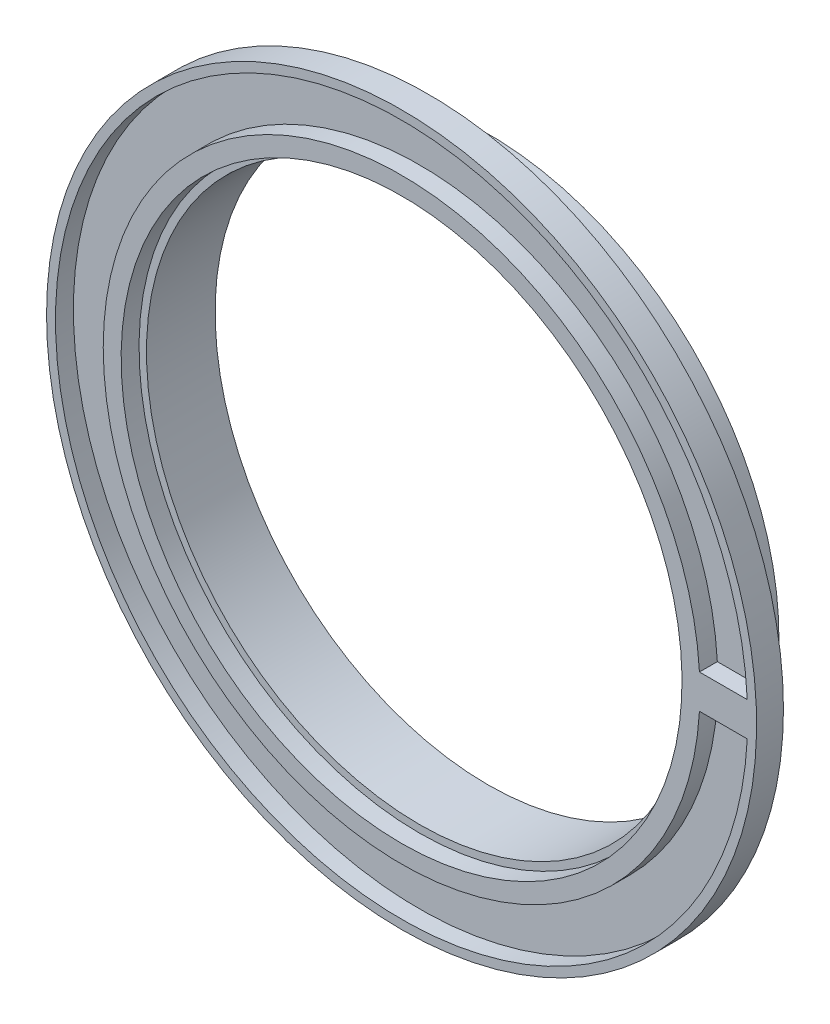
ISO-10303-21;
HEADER;
FILE_DESCRIPTION(('STEP AP214'),'2;1');
FILE_NAME('part.step','',(''),(''),'','','');
FILE_SCHEMA(('AUTOMOTIVE_DESIGN { 1 0 10303 214 1 1 1 1 }'));
ENDSEC;
DATA;
#1=APPLICATION_CONTEXT('core data for automotive mechanical design processes');
#2=APPLICATION_PROTOCOL_DEFINITION('international standard','automotive_design',2000,#1);
#3=PRODUCT_CONTEXT('',#1,'mechanical');
#4=PRODUCT('Part','Part','',(#3));
#5=PRODUCT_RELATED_PRODUCT_CATEGORY('part','',(#4));
#6=PRODUCT_DEFINITION_FORMATION('','',#4);
#7=PRODUCT_DEFINITION_CONTEXT('part definition',#1,'design');
#8=PRODUCT_DEFINITION('design','',#6,#7);
#9=PRODUCT_DEFINITION_SHAPE('','',#8);
#10=(LENGTH_UNIT() NAMED_UNIT(*) SI_UNIT(.MILLI.,.METRE.));
#11=(NAMED_UNIT(*) PLANE_ANGLE_UNIT() SI_UNIT($,.RADIAN.));
#12=(NAMED_UNIT(*) SI_UNIT($,.STERADIAN.) SOLID_ANGLE_UNIT());
#13=UNCERTAINTY_MEASURE_WITH_UNIT(LENGTH_MEASURE(1.E-05),#10,'distance_accuracy_value','');
#14=(GEOMETRIC_REPRESENTATION_CONTEXT(3) GLOBAL_UNCERTAINTY_ASSIGNED_CONTEXT((#13)) GLOBAL_UNIT_ASSIGNED_CONTEXT((#10,
#11,#12)) REPRESENTATION_CONTEXT('',''));
#15=CARTESIAN_POINT('',(0.,0.,0.));
#16=DIRECTION('',(0.,0.,1.));
#17=DIRECTION('',(1.,0.,0.));
#18=AXIS2_PLACEMENT_3D('',#15,#16,#17);
#19=CARTESIAN_POINT('',(-0.0195470693560484,0.0021960919807713,81.7922710574948));
#20=DIRECTION('',(0.,0.,1.));
#21=DIRECTION('',(0.,-1.,0.));
#22=AXIS2_PLACEMENT_3D('',#19,#20,#21);
#23=CYLINDRICAL_SURFACE('',#22,58.);
#24=DIRECTION('',(0.,0.,-1.));
#25=VECTOR('',#24,1.);
#26=CARTESIAN_POINT('',(57.9103890604235,2.85219609192162,84.7922710574948));
#27=LINE('',#26,#25);
#28=CARTESIAN_POINT('',(57.9103890604235,2.85219609192162,84.7922710574948));
#29=VERTEX_POINT('',#28);
#30=CARTESIAN_POINT('',(57.9103890604235,2.85219609192162,81.7922710574948));
#31=VERTEX_POINT('',#30);
#32=EDGE_CURVE('E35',#29,#31,#27,.T.);
#33=ORIENTED_EDGE('',*,*,#32,.F.);
#34=CARTESIAN_POINT('',(-0.0195470693560484,0.0021960919807713,84.7922710574948));
#35=DIRECTION('',(0.,0.,1.));
#36=DIRECTION('',(0.,-1.,0.));
#37=AXIS2_PLACEMENT_3D('',#34,#35,#36);
#38=CIRCLE('',#37,58.);
#39=CARTESIAN_POINT('',(57.9103890604199,-2.84780390803485,84.7922710574948));
#40=VERTEX_POINT('',#39);
#41=EDGE_CURVE('E11',#29,#40,#38,.T.);
#42=ORIENTED_EDGE('',*,*,#41,.T.);
#43=DIRECTION('',(0.,0.,-1.));
#44=VECTOR('',#43,1.);
#45=CARTESIAN_POINT('',(57.9103890604199,-2.84780390803485,84.7922710574948));
#46=LINE('',#45,#44);
#47=CARTESIAN_POINT('',(57.9103890604199,-2.84780390803485,81.7922710574948));
#48=VERTEX_POINT('',#47);
#49=EDGE_CURVE('E27',#40,#48,#46,.T.);
#50=ORIENTED_EDGE('',*,*,#49,.T.);
#51=CARTESIAN_POINT('',(-0.0195470693560484,0.0021960919807713,81.7922710574948));
#52=DIRECTION('',(0.,0.,1.));
#53=DIRECTION('',(0.,-1.,0.));
#54=AXIS2_PLACEMENT_3D('',#51,#52,#53);
#55=CIRCLE('',#54,58.);
#56=EDGE_CURVE('E128',#31,#48,#55,.T.);
#57=ORIENTED_EDGE('',*,*,#56,.F.);
#58=EDGE_LOOP('',(#33,#42,#50,#57));
#59=FACE_BOUND('',#58,.T.);
#60=ADVANCED_FACE('F17',(#59),#23,.F.);
#61=CARTESIAN_POINT('',(-0.0195470693560484,0.0021960919807713,81.7922710574948));
#62=DIRECTION('',(0.,0.,1.));
#63=DIRECTION('',(0.,-1.,0.));
#64=AXIS2_PLACEMENT_3D('',#61,#62,#63);
#65=CYLINDRICAL_SURFACE('',#64,50.);
#66=DIRECTION('',(0.,0.,-1.));
#67=VECTOR('',#66,1.);
#68=CARTESIAN_POINT('',(49.8991618482431,2.85219609198071,84.7922710574948));
#69=LINE('',#68,#67);
#70=CARTESIAN_POINT('',(49.8991618482431,2.85219609198071,84.7922710574948));
#71=VERTEX_POINT('',#70);
#72=CARTESIAN_POINT('',(49.8991618482431,2.85219609198071,81.7922710574948));
#73=VERTEX_POINT('',#72);
#74=EDGE_CURVE('E134',#71,#73,#69,.T.);
#75=ORIENTED_EDGE('',*,*,#74,.T.);
#76=CARTESIAN_POINT('',(-0.0195470693560484,0.0021960919807713,81.7922710574948));
#77=DIRECTION('',(0.,0.,-1.));
#78=DIRECTION('',(0.,-1.,0.));
#79=AXIS2_PLACEMENT_3D('',#76,#77,#78);
#80=CIRCLE('',#79,50.);
#81=CARTESIAN_POINT('',(49.8991618482431,-2.84780390801929,81.7922710574948));
#82=VERTEX_POINT('',#81);
#83=EDGE_CURVE('E135',#82,#73,#80,.T.);
#84=ORIENTED_EDGE('',*,*,#83,.F.);
#85=DIRECTION('',(0.,0.,-1.));
#86=VECTOR('',#85,1.);
#87=CARTESIAN_POINT('',(49.8991618482429,-2.84780390802395,84.7922710574948));
#88=LINE('',#87,#86);
#89=CARTESIAN_POINT('',(49.8991618482429,-2.84780390802395,84.7922710574948));
#90=VERTEX_POINT('',#89);
#91=EDGE_CURVE('E89',#90,#82,#88,.T.);
#92=ORIENTED_EDGE('',*,*,#91,.F.);
#93=CARTESIAN_POINT('',(-0.0195470693560484,0.0021960919807713,84.7922710574948));
#94=DIRECTION('',(0.,0.,-1.));
#95=DIRECTION('',(0.,-1.,0.));
#96=AXIS2_PLACEMENT_3D('',#93,#94,#95);
#97=CIRCLE('',#96,50.);
#98=EDGE_CURVE('E133',#90,#71,#97,.T.);
#99=ORIENTED_EDGE('',*,*,#98,.T.);
#100=EDGE_LOOP('',(#75,#84,#92,#99));
#101=FACE_BOUND('',#100,.T.);
#102=ADVANCED_FACE('F153',(#101),#65,.T.);
#103=CARTESIAN_POINT('',(-0.0195470693560484,0.0021960919807713,81.7922710574948));
#104=DIRECTION('',(0.,0.,1.));
#105=DIRECTION('',(0.,-1.,0.));
#106=AXIS2_PLACEMENT_3D('',#103,#104,#105);
#107=PLANE('',#106);
#108=ORIENTED_EDGE('',*,*,#83,.T.);
#109=DIRECTION('',(-1.,0.,0.));
#110=VECTOR('',#109,1.);
#111=CARTESIAN_POINT('',(57.9103890604206,2.8521960919807,81.7922710574948));
#112=LINE('',#111,#110);
#113=EDGE_CURVE('E107',#31,#73,#112,.T.);
#114=ORIENTED_EDGE('',*,*,#113,.F.);
#115=ORIENTED_EDGE('',*,*,#56,.T.);
#116=DIRECTION('',(1.,0.,0.));
#117=VECTOR('',#116,1.);
#118=CARTESIAN_POINT('',(49.8991618482431,-2.84780390801929,81.7922710574948));
#119=LINE('',#118,#117);
#120=EDGE_CURVE('E91',#82,#48,#119,.T.);
#121=ORIENTED_EDGE('',*,*,#120,.F.);
#122=EDGE_LOOP('',(#108,#114,#115,#121));
#123=FACE_BOUND('',#122,.T.);
#124=ADVANCED_FACE('F150',(#123),#107,.T.);
#125=CARTESIAN_POINT('',(-0.0195470693560484,0.0021960919807713,84.7922710574948));
#126=DIRECTION('',(0.,0.,-1.));
#127=DIRECTION('',(0.,1.,0.));
#128=AXIS2_PLACEMENT_3D('',#125,#126,#127);
#129=PLANE('',#128);
#130=CARTESIAN_POINT('',(-0.0195470693560484,0.0021960919807713,84.7922710574948));
#131=DIRECTION('',(0.,0.,-1.));
#132=DIRECTION('',(0.,-1.,0.));
#133=AXIS2_PLACEMENT_3D('',#130,#131,#132);
#134=CIRCLE('',#133,47.);
#135=CARTESIAN_POINT('',(-0.0195470693560427,-46.9978039080192,84.7922710574948));
#136=VERTEX_POINT('',#135);
#137=EDGE_CURVE('E125',#136,#136,#134,.T.);
#138=ORIENTED_EDGE('',*,*,#137,.T.);
#139=EDGE_LOOP('',(#138));
#140=FACE_BOUND('',#139,.T.);
#141=ORIENTED_EDGE('',*,*,#98,.F.);
#142=DIRECTION('',(1.,0.,0.));
#143=VECTOR('',#142,1.);
#144=CARTESIAN_POINT('',(49.8991618482431,-2.84780390801929,84.7922710574948));
#145=LINE('',#144,#143);
#146=EDGE_CURVE('E122',#90,#40,#145,.T.);
#147=ORIENTED_EDGE('',*,*,#146,.T.);
#148=ORIENTED_EDGE('',*,*,#41,.F.);
#149=DIRECTION('',(-1.,0.,0.));
#150=VECTOR('',#149,1.);
#151=CARTESIAN_POINT('',(57.9103890604206,2.8521960919807,84.7922710574948));
#152=LINE('',#151,#150);
#153=EDGE_CURVE('E117',#29,#71,#152,.T.);
#154=ORIENTED_EDGE('',*,*,#153,.T.);
#155=EDGE_LOOP('',(#141,#147,#148,#154));
#156=FACE_BOUND('',#155,.T.);
#157=CARTESIAN_POINT('',(-0.0195470693560484,0.0021960919807713,84.7922710574948));
#158=DIRECTION('',(0.,0.,-1.));
#159=DIRECTION('',(0.,-1.,0.));
#160=AXIS2_PLACEMENT_3D('',#157,#158,#159);
#161=CIRCLE('',#160,59.5);
#162=CARTESIAN_POINT('',(-0.0195470693560412,-59.4978039080192,84.7922710574948));
#163=VERTEX_POINT('',#162);
#164=EDGE_CURVE('E104',#163,#163,#161,.T.);
#165=ORIENTED_EDGE('',*,*,#164,.F.);
#166=EDGE_LOOP('',(#165));
#167=FACE_BOUND('',#166,.T.);
#168=ADVANCED_FACE('F156',(#140,#156,#167),#129,.F.);
#169=CARTESIAN_POINT('',(-0.0195470693560484,0.0021960919807713,80.2922710574948));
#170=DIRECTION('',(0.,0.,-1.));
#171=DIRECTION('',(0.,1.,0.));
#172=AXIS2_PLACEMENT_3D('',#169,#170,#171);
#173=PLANE('',#172);
#174=CARTESIAN_POINT('',(-0.0195470693560484,0.0021960919807713,80.2922710574948));
#175=DIRECTION('',(0.,0.,-1.));
#176=DIRECTION('',(0.,-1.,0.));
#177=AXIS2_PLACEMENT_3D('',#174,#175,#176);
#178=CIRCLE('',#177,59.5);
#179=CARTESIAN_POINT('',(-59.5195470693559,0.00219609241977516,80.2922710574948));
#180=VERTEX_POINT('',#179);
#181=EDGE_CURVE('E114',#180,#180,#178,.T.);
#182=ORIENTED_EDGE('',*,*,#181,.T.);
#183=CARTESIAN_POINT('',(-56.7695470693559,0.00219609239948497,80.2922710574948));
#184=DIRECTION('',(0.,0.,1.));
#185=DIRECTION('',(1.,0.,0.));
#186=AXIS2_PLACEMENT_3D('',#183,#184,#185);
#187=CIRCLE('',#186,2.75);
#188=EDGE_CURVE('E111',#180,#180,#187,.T.);
#189=ORIENTED_EDGE('',*,*,#188,.T.);
#190=EDGE_LOOP('',(#182,#189));
#191=FACE_BOUND('',#190,.T.);
#192=CARTESIAN_POINT('',(-0.0195470693560484,0.0021960919807713,80.2922710574948));
#193=DIRECTION('',(0.,0.,1.));
#194=DIRECTION('',(0.,-1.,0.));
#195=AXIS2_PLACEMENT_3D('',#192,#193,#194);
#196=CIRCLE('',#195,48.75);
#197=CARTESIAN_POINT('',(-0.0195470693560484,-48.7478039080192,80.2922710574948));
#198=VERTEX_POINT('',#197);
#199=EDGE_CURVE('E108',#198,#198,#196,.T.);
#200=ORIENTED_EDGE('',*,*,#199,.T.);
#201=EDGE_LOOP('',(#200));
#202=FACE_BOUND('',#201,.T.);
#203=ADVANCED_FACE('F184',(#191,#202),#173,.T.);
#204=CARTESIAN_POINT('',(-0.0195470693560484,0.0021960919807713,84.7922710574948));
#205=DIRECTION('',(0.,0.,-1.));
#206=DIRECTION('',(0.,1.,0.));
#207=AXIS2_PLACEMENT_3D('',#204,#205,#206);
#208=CYLINDRICAL_SURFACE('',#207,59.5);
#209=ORIENTED_EDGE('',*,*,#164,.T.);
#210=EDGE_LOOP('',(#209));
#211=FACE_BOUND('',#210,.T.);
#212=ORIENTED_EDGE('',*,*,#181,.F.);
#213=EDGE_LOOP('',(#212));
#214=FACE_BOUND('',#213,.T.);
#215=ADVANCED_FACE('F188',(#211,#214),#208,.T.);
#216=CARTESIAN_POINT('',(-0.0195470693560484,0.0021960919807713,84.7922710574948));
#217=DIRECTION('',(0.,0.,-1.));
#218=DIRECTION('',(0.,1.,0.));
#219=AXIS2_PLACEMENT_3D('',#216,#217,#218);
#220=CYLINDRICAL_SURFACE('',#219,45.75);
#221=CARTESIAN_POINT('',(-0.0195470693560484,0.0021960919807713,81.7922710574948));
#222=DIRECTION('',(0.,0.,-1.));
#223=DIRECTION('',(0.,1.,0.));
#224=AXIS2_PLACEMENT_3D('',#221,#222,#223);
#225=CIRCLE('',#224,45.75);
#226=CARTESIAN_POINT('',(-0.0195470693560484,45.7521960919808,81.7922710574948));
#227=VERTEX_POINT('',#226);
#228=EDGE_CURVE('E98',#227,#227,#225,.T.);
#229=ORIENTED_EDGE('',*,*,#228,.F.);
#230=EDGE_LOOP('',(#229));
#231=FACE_BOUND('',#230,.T.);
#232=CARTESIAN_POINT('',(-0.0195470693560484,0.0021960919807713,70.2922710574948));
#233=DIRECTION('',(0.,0.,-1.));
#234=DIRECTION('',(0.,-1.,0.));
#235=AXIS2_PLACEMENT_3D('',#232,#233,#234);
#236=CIRCLE('',#235,45.75);
#237=CARTESIAN_POINT('',(-0.0195470693560429,-45.7478039080192,70.2922710574948));
#238=VERTEX_POINT('',#237);
#239=EDGE_CURVE('E101',#238,#238,#236,.T.);
#240=ORIENTED_EDGE('',*,*,#239,.T.);
#241=EDGE_LOOP('',(#240));
#242=FACE_BOUND('',#241,.T.);
#243=ADVANCED_FACE('F192',(#231,#242),#220,.F.);
#244=CARTESIAN_POINT('',(-0.0195470693560484,0.0021960919807713,80.2922710574948));
#245=DIRECTION('',(0.,0.,-1.));
#246=DIRECTION('',(0.,1.,0.));
#247=AXIS2_PLACEMENT_3D('',#244,#245,#246);
#248=CYLINDRICAL_SURFACE('',#247,48.75);
#249=ORIENTED_EDGE('',*,*,#199,.F.);
#250=EDGE_LOOP('',(#249));
#251=FACE_BOUND('',#250,.T.);
#252=CARTESIAN_POINT('',(-0.0195470693560484,0.0021960919807713,70.2922710574948));
#253=DIRECTION('',(0.,0.,1.));
#254=DIRECTION('',(0.,-1.,0.));
#255=AXIS2_PLACEMENT_3D('',#252,#253,#254);
#256=CIRCLE('',#255,48.75);
#257=CARTESIAN_POINT('',(-0.0195470693560484,-48.7478039080192,70.2922710574948));
#258=VERTEX_POINT('',#257);
#259=EDGE_CURVE('E97',#258,#258,#256,.T.);
#260=ORIENTED_EDGE('',*,*,#259,.T.);
#261=EDGE_LOOP('',(#260));
#262=FACE_BOUND('',#261,.T.);
#263=ADVANCED_FACE('F196',(#251,#262),#248,.T.);
#264=CARTESIAN_POINT('',(-0.0195470693560484,0.0021960919807713,70.2922710574948));
#265=DIRECTION('',(0.,0.,1.));
#266=DIRECTION('',(0.,-1.,0.));
#267=AXIS2_PLACEMENT_3D('',#264,#265,#266);
#268=PLANE('',#267);
#269=ORIENTED_EDGE('',*,*,#259,.F.);
#270=EDGE_LOOP('',(#269));
#271=FACE_BOUND('',#270,.T.);
#272=ORIENTED_EDGE('',*,*,#239,.F.);
#273=EDGE_LOOP('',(#272));
#274=FACE_BOUND('',#273,.T.);
#275=ADVANCED_FACE('F200',(#271,#274),#268,.F.);
#276=CARTESIAN_POINT('',(-0.0195470693560484,0.0021960919807713,81.7922710574948));
#277=DIRECTION('',(0.,0.,1.));
#278=DIRECTION('',(0.,-1.,0.));
#279=AXIS2_PLACEMENT_3D('',#276,#277,#278);
#280=CYLINDRICAL_SURFACE('',#279,47.);
#281=CARTESIAN_POINT('',(-0.0195470693560484,0.0021960919807713,81.7922710574948));
#282=DIRECTION('',(0.,0.,-1.));
#283=DIRECTION('',(0.,-1.,0.));
#284=AXIS2_PLACEMENT_3D('',#281,#282,#283);
#285=CIRCLE('',#284,47.);
#286=CARTESIAN_POINT('',(-0.0195470693560427,-46.9978039080192,81.7922710574948));
#287=VERTEX_POINT('',#286);
#288=EDGE_CURVE('E94',#287,#287,#285,.T.);
#289=ORIENTED_EDGE('',*,*,#288,.T.);
#290=EDGE_LOOP('',(#289));
#291=FACE_BOUND('',#290,.T.);
#292=ORIENTED_EDGE('',*,*,#137,.F.);
#293=EDGE_LOOP('',(#292));
#294=FACE_BOUND('',#293,.T.);
#295=ADVANCED_FACE('F204',(#291,#294),#280,.F.);
#296=CARTESIAN_POINT('',(-0.0195470693560484,0.0021960919807713,81.7922710574948));
#297=DIRECTION('',(0.,0.,-1.));
#298=DIRECTION('',(0.,1.,0.));
#299=AXIS2_PLACEMENT_3D('',#296,#297,#298);
#300=PLANE('',#299);
#301=ORIENTED_EDGE('',*,*,#228,.T.);
#302=EDGE_LOOP('',(#301));
#303=FACE_BOUND('',#302,.T.);
#304=ORIENTED_EDGE('',*,*,#288,.F.);
#305=EDGE_LOOP('',(#304));
#306=FACE_BOUND('',#305,.T.);
#307=ADVANCED_FACE('F171',(#303,#306),#300,.F.);
#308=CARTESIAN_POINT('',(57.9103890604206,2.8521960919807,84.7922710574948));
#309=DIRECTION('',(0.,-1.,0.));
#310=DIRECTION('',(1.,0.,0.));
#311=AXIS2_PLACEMENT_3D('',#308,#309,#310);
#312=PLANE('',#311);
#313=ORIENTED_EDGE('',*,*,#113,.T.);
#314=ORIENTED_EDGE('',*,*,#74,.F.);
#315=ORIENTED_EDGE('',*,*,#153,.F.);
#316=ORIENTED_EDGE('',*,*,#32,.T.);
#317=EDGE_LOOP('',(#313,#314,#315,#316));
#318=FACE_BOUND('',#317,.T.);
#319=ADVANCED_FACE('F145',(#318),#312,.F.);
#320=CARTESIAN_POINT('',(49.8991618482431,-2.84780390801929,84.7922710574948));
#321=DIRECTION('',(0.,1.,0.));
#322=DIRECTION('',(-1.,0.,0.));
#323=AXIS2_PLACEMENT_3D('',#320,#321,#322);
#324=PLANE('',#323);
#325=ORIENTED_EDGE('',*,*,#120,.T.);
#326=ORIENTED_EDGE('',*,*,#49,.F.);
#327=ORIENTED_EDGE('',*,*,#146,.F.);
#328=ORIENTED_EDGE('',*,*,#91,.T.);
#329=EDGE_LOOP('',(#325,#326,#327,#328));
#330=FACE_BOUND('',#329,.T.);
#331=ADVANCED_FACE('F160',(#330),#324,.F.);
#332=CARTESIAN_POINT('',(-56.7695470693559,0.00219609239948497,78.2922710574948));
#333=DIRECTION('',(0.,0.,1.));
#334=DIRECTION('',(0.,-1.,0.));
#335=AXIS2_PLACEMENT_3D('',#332,#333,#334);
#336=CYLINDRICAL_SURFACE('',#335,2.75);
#337=CARTESIAN_POINT('',(-56.7695470693559,0.00219609239948497,78.7922710574948));
#338=DIRECTION('',(0.,0.,1.));
#339=DIRECTION('',(0.,-1.,0.));
#340=AXIS2_PLACEMENT_3D('',#337,#338,#339);
#341=CIRCLE('',#340,2.75);
#342=CARTESIAN_POINT('',(-56.7695470693559,-2.74780390760052,78.7922710574948));
#343=VERTEX_POINT('',#342);
#344=EDGE_CURVE('E84',#343,#343,#341,.T.);
#345=ORIENTED_EDGE('',*,*,#344,.T.);
#346=EDGE_LOOP('',(#345));
#347=FACE_BOUND('',#346,.T.);
#348=ORIENTED_EDGE('',*,*,#188,.F.);
#349=EDGE_LOOP('',(#348));
#350=FACE_BOUND('',#349,.T.);
#351=ADVANCED_FACE('F162',(#347,#350),#336,.T.);
#352=CARTESIAN_POINT('',(-56.7695470693559,0.00219609239948497,78.2922710574948));
#353=DIRECTION('',(0.,0.,1.));
#354=DIRECTION('',(0.,-1.,0.));
#355=AXIS2_PLACEMENT_3D('',#352,#353,#354);
#356=PLANE('',#355);
#357=CARTESIAN_POINT('',(-56.7695470693559,0.00219609239948497,78.2922710574948));
#358=DIRECTION('',(0.,0.,-1.));
#359=DIRECTION('',(0.,-1.,0.));
#360=AXIS2_PLACEMENT_3D('',#357,#358,#359);
#361=CIRCLE('',#360,2.25);
#362=CARTESIAN_POINT('',(-56.7695470693559,-2.24780390760052,78.2922710574948));
#363=VERTEX_POINT('',#362);
#364=EDGE_CURVE('E21',#363,#363,#361,.T.);
#365=ORIENTED_EDGE('',*,*,#364,.T.);
#366=EDGE_LOOP('',(#365));
#367=FACE_BOUND('',#366,.T.);
#368=ADVANCED_FACE('F169',(#367),#356,.F.);
#369=CARTESIAN_POINT('',(-56.7695470693559,0.00219609239948497,78.7922710574948));
#370=DIRECTION('',(0.,0.,1.));
#371=DIRECTION('',(0.,-1.,0.));
#372=AXIS2_PLACEMENT_3D('',#369,#370,#371);
#373=TOROIDAL_SURFACE('',#372,2.25,0.5);
#374=ORIENTED_EDGE('',*,*,#364,.F.);
#375=EDGE_LOOP('',(#374));
#376=FACE_BOUND('',#375,.T.);
#377=ORIENTED_EDGE('',*,*,#344,.F.);
#378=EDGE_LOOP('',(#377));
#379=FACE_BOUND('',#378,.T.);
#380=ADVANCED_FACE('F19',(#376,#379),#373,.T.);
#381=CLOSED_SHELL('',(#60,#102,#124,#168,#203,#215,#243,#263,#275,#295,#307,#319,#331,#351,#368,#380));
#382=MANIFOLD_SOLID_BREP('B1',#381);
#383=ADVANCED_BREP_SHAPE_REPRESENTATION('',(#18,#382),#14);
#384=SHAPE_DEFINITION_REPRESENTATION(#9,#383);
ENDSEC;
END-ISO-10303-21;
